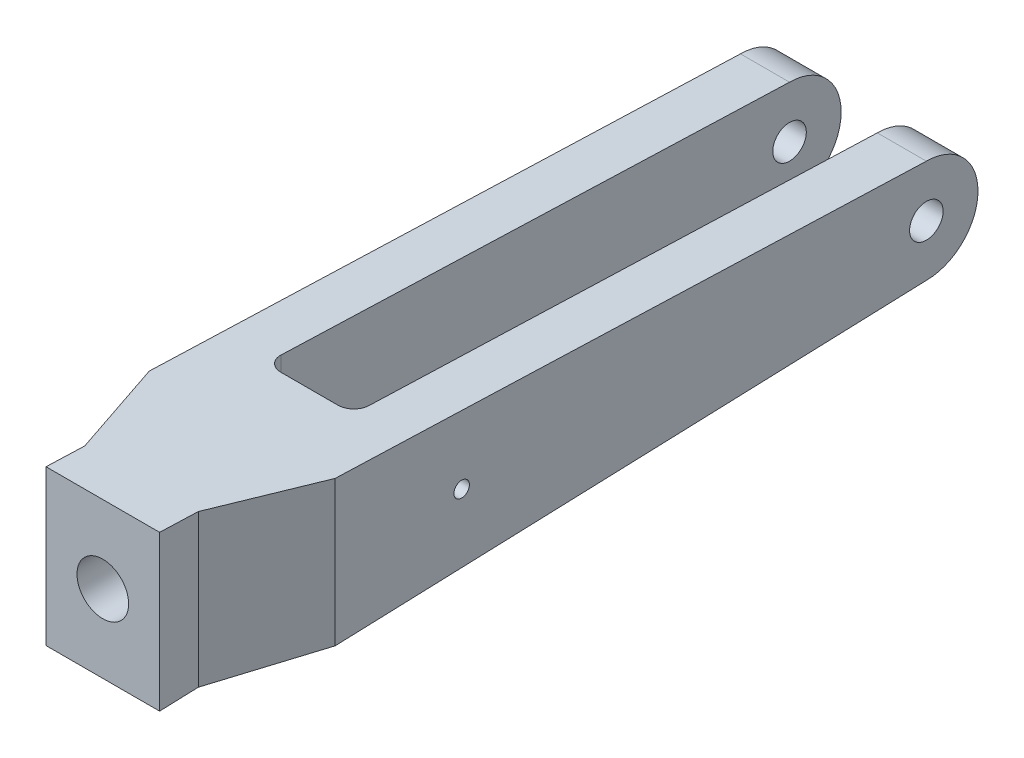
ISO-10303-21;
HEADER;
FILE_DESCRIPTION(('STEP AP214'),'2;1');
FILE_NAME('part.step','',(''),(''),'','','');
FILE_SCHEMA(('AUTOMOTIVE_DESIGN { 1 0 10303 214 1 1 1 1 }'));
ENDSEC;
DATA;
#1=APPLICATION_CONTEXT('core data for automotive mechanical design processes');
#2=APPLICATION_PROTOCOL_DEFINITION('international standard','automotive_design',2000,#1);
#3=PRODUCT_CONTEXT('',#1,'mechanical');
#4=PRODUCT('Part','Part','',(#3));
#5=PRODUCT_RELATED_PRODUCT_CATEGORY('part','',(#4));
#6=PRODUCT_DEFINITION_FORMATION('','',#4);
#7=PRODUCT_DEFINITION_CONTEXT('part definition',#1,'design');
#8=PRODUCT_DEFINITION('design','',#6,#7);
#9=PRODUCT_DEFINITION_SHAPE('','',#8);
#10=(LENGTH_UNIT() NAMED_UNIT(*) SI_UNIT(.MILLI.,.METRE.));
#11=(NAMED_UNIT(*) PLANE_ANGLE_UNIT() SI_UNIT($,.RADIAN.));
#12=(NAMED_UNIT(*) SI_UNIT($,.STERADIAN.) SOLID_ANGLE_UNIT());
#13=UNCERTAINTY_MEASURE_WITH_UNIT(LENGTH_MEASURE(1.E-05),#10,'distance_accuracy_value','');
#14=(GEOMETRIC_REPRESENTATION_CONTEXT(3) GLOBAL_UNCERTAINTY_ASSIGNED_CONTEXT((#13)) GLOBAL_UNIT_ASSIGNED_CONTEXT((#10,
#11,#12)) REPRESENTATION_CONTEXT('',''));
#15=CARTESIAN_POINT('',(0.,0.,0.));
#16=DIRECTION('',(0.,0.,1.));
#17=DIRECTION('',(1.,0.,0.));
#18=AXIS2_PLACEMENT_3D('',#15,#16,#17);
#19=CARTESIAN_POINT('',(28.9987484387064,30.,-26.9990106338886));
#20=DIRECTION('',(-1.,0.,0.));
#21=DIRECTION('',(0.,0.,1.));
#22=AXIS2_PLACEMENT_3D('',#19,#20,#21);
#23=PLANE('',#22);
#24=CARTESIAN_POINT('',(28.9987484387064,15.,-141.499010633889));
#25=DIRECTION('',(1.,0.,0.));
#26=DIRECTION('',(0.,0.,-1.));
#27=AXIS2_PLACEMENT_3D('',#24,#25,#26);
#28=CIRCLE('',#27,3.25000000000001);
#29=CARTESIAN_POINT('',(28.9987484387064,15.,-144.749010633889));
#30=VERTEX_POINT('',#29);
#31=EDGE_CURVE('E244',#30,#30,#28,.T.);
#32=ORIENTED_EDGE('',*,*,#31,.F.);
#33=EDGE_LOOP('',(#32));
#34=FACE_BOUND('',#33,.T.);
#35=CARTESIAN_POINT('',(28.9987484387064,15.,-51.4990106338886));
#36=DIRECTION('',(1.,0.,0.));
#37=DIRECTION('',(0.,0.,-1.));
#38=AXIS2_PLACEMENT_3D('',#35,#36,#37);
#39=CIRCLE('',#38,1.5);
#40=CARTESIAN_POINT('',(28.9987484387064,15.,-52.9990106338886));
#41=VERTEX_POINT('',#40);
#42=EDGE_CURVE('E241',#41,#41,#39,.T.);
#43=ORIENTED_EDGE('',*,*,#42,.F.);
#44=EDGE_LOOP('',(#43));
#45=FACE_BOUND('',#44,.T.);
#46=DIRECTION('',(0.,0.0353136494193685,-0.999376278568131));
#47=VECTOR('',#46,1.);
#48=CARTESIAN_POINT('',(28.9987484387064,3.49163363455736E-05,1.23379280373051E-06));
#49=LINE('',#48,#47);
#50=CARTESIAN_POINT('',(28.9987484387064,0.954063604240281,-26.9990106338886));
#51=VERTEX_POINT('',#50);
#52=CARTESIAN_POINT('',(28.9987484387064,4.99999999999999,-141.499010633889));
#53=VERTEX_POINT('',#52);
#54=EDGE_CURVE('E232',#51,#53,#49,.T.);
#55=ORIENTED_EDGE('',*,*,#54,.T.);
#56=CARTESIAN_POINT('',(28.9987484387064,15.,-141.499010633889));
#57=DIRECTION('',(1.,0.,0.));
#58=DIRECTION('',(0.,0.,-1.));
#59=AXIS2_PLACEMENT_3D('',#56,#57,#58);
#60=CIRCLE('',#59,10.);
#61=CARTESIAN_POINT('',(28.9987484387064,25.,-141.499010633889));
#62=VERTEX_POINT('',#61);
#63=EDGE_CURVE('E217',#53,#62,#60,.T.);
#64=ORIENTED_EDGE('',*,*,#63,.T.);
#65=DIRECTION('',(0.,-0.0353136494193685,-0.999376278568131));
#66=VECTOR('',#65,1.);
#67=CARTESIAN_POINT('',(28.9987484387064,29.9625534686042,-1.05874747238884));
#68=LINE('',#67,#66);
#69=CARTESIAN_POINT('',(28.9987484387064,29.0459363957597,-26.9990106338886));
#70=VERTEX_POINT('',#69);
#71=EDGE_CURVE('E228',#70,#62,#68,.T.);
#72=ORIENTED_EDGE('',*,*,#71,.F.);
#73=DIRECTION('',(0.,-1.,0.));
#74=VECTOR('',#73,1.);
#75=CARTESIAN_POINT('',(28.9987484387064,30.,-26.9990106338886));
#76=LINE('',#75,#74);
#77=EDGE_CURVE('E240',#70,#51,#76,.T.);
#78=ORIENTED_EDGE('',*,*,#77,.T.);
#79=EDGE_LOOP('',(#55,#64,#72,#78));
#80=FACE_BOUND('',#79,.T.);
#81=ADVANCED_FACE('F118',(#34,#45,#80),#23,.F.);
#82=CARTESIAN_POINT('',(19.4987484387064,30.,-39.9990106338886));
#83=DIRECTION('',(1.,0.,0.));
#84=DIRECTION('',(0.,0.,-1.));
#85=AXIS2_PLACEMENT_3D('',#82,#83,#84);
#86=PLANE('',#85);
#87=CARTESIAN_POINT('',(19.4987484387064,15.,-141.499010633889));
#88=DIRECTION('',(1.,0.,0.));
#89=DIRECTION('',(0.,0.,-1.));
#90=AXIS2_PLACEMENT_3D('',#87,#88,#89);
#91=CIRCLE('',#90,3.25000000000001);
#92=CARTESIAN_POINT('',(19.4987484387064,15.,-144.749010633889));
#93=VERTEX_POINT('',#92);
#94=EDGE_CURVE('E229',#93,#93,#91,.T.);
#95=ORIENTED_EDGE('',*,*,#94,.T.);
#96=EDGE_LOOP('',(#95));
#97=FACE_BOUND('',#96,.T.);
#98=CARTESIAN_POINT('',(19.4987484387064,15.,-51.4990106338886));
#99=DIRECTION('',(1.,0.,0.));
#100=DIRECTION('',(0.,0.,-1.));
#101=AXIS2_PLACEMENT_3D('',#98,#99,#100);
#102=CIRCLE('',#101,1.5);
#103=CARTESIAN_POINT('',(19.4987484387064,15.,-52.9990106338886));
#104=VERTEX_POINT('',#103);
#105=EDGE_CURVE('E269',#104,#104,#102,.T.);
#106=ORIENTED_EDGE('',*,*,#105,.T.);
#107=EDGE_LOOP('',(#106));
#108=FACE_BOUND('',#107,.T.);
#109=DIRECTION('',(0.,0.0353136494193685,-0.999376278568131));
#110=VECTOR('',#109,1.);
#111=CARTESIAN_POINT('',(19.4987484387064,1.44907655663495,-41.0078771866577));
#112=LINE('',#111,#110);
#113=CARTESIAN_POINT('',(19.4987484387064,1.51943462897526,-42.9990106338886));
#114=VERTEX_POINT('',#113);
#115=CARTESIAN_POINT('',(19.4987484387064,4.99999999999999,-141.499010633889));
#116=VERTEX_POINT('',#115);
#117=EDGE_CURVE('E234',#114,#116,#112,.T.);
#118=ORIENTED_EDGE('',*,*,#117,.F.);
#119=DIRECTION('',(0.,-1.,0.));
#120=VECTOR('',#119,1.);
#121=CARTESIAN_POINT('',(19.4987484387064,28.5865724381625,-42.9990106338886));
#122=LINE('',#121,#120);
#123=CARTESIAN_POINT('',(19.4987484387064,28.4805653710247,-42.9990106338886));
#124=VERTEX_POINT('',#123);
#125=EDGE_CURVE('E133',#114,#124,#122,.F.);
#126=ORIENTED_EDGE('',*,*,#125,.T.);
#127=DIRECTION('',(0.,-0.0353136494193685,-0.999376278568131));
#128=VECTOR('',#127,1.);
#129=CARTESIAN_POINT('',(19.4987484387064,28.5883350584245,-39.9491284804761));
#130=LINE('',#129,#128);
#131=CARTESIAN_POINT('',(19.4987484387064,25.,-141.499010633889));
#132=VERTEX_POINT('',#131);
#133=EDGE_CURVE('E302',#124,#132,#130,.T.);
#134=ORIENTED_EDGE('',*,*,#133,.T.);
#135=CARTESIAN_POINT('',(19.4987484387064,15.,-141.499010633889));
#136=DIRECTION('',(1.,0.,0.));
#137=DIRECTION('',(0.,0.,-1.));
#138=AXIS2_PLACEMENT_3D('',#135,#136,#137);
#139=CIRCLE('',#138,10.);
#140=EDGE_CURVE('E306',#116,#132,#139,.T.);
#141=ORIENTED_EDGE('',*,*,#140,.F.);
#142=EDGE_LOOP('',(#118,#126,#134,#141));
#143=FACE_BOUND('',#142,.T.);
#144=ADVANCED_FACE('F368',(#97,#108,#143),#86,.F.);
#145=CARTESIAN_POINT('',(2.4987484387064,30.,-151.499010633889));
#146=DIRECTION('',(-1.,0.,0.));
#147=DIRECTION('',(0.,0.,1.));
#148=AXIS2_PLACEMENT_3D('',#145,#146,#147);
#149=PLANE('',#148);
#150=CARTESIAN_POINT('',(2.4987484387064,15.,-141.499010633889));
#151=DIRECTION('',(-1.,0.,0.));
#152=DIRECTION('',(0.,0.,1.));
#153=AXIS2_PLACEMENT_3D('',#150,#151,#152);
#154=CIRCLE('',#153,3.25000000000001);
#155=CARTESIAN_POINT('',(2.4987484387064,15.,-144.749010633889));
#156=VERTEX_POINT('',#155);
#157=EDGE_CURVE('E273',#156,#156,#154,.T.);
#158=ORIENTED_EDGE('',*,*,#157,.T.);
#159=EDGE_LOOP('',(#158));
#160=FACE_BOUND('',#159,.T.);
#161=CARTESIAN_POINT('',(2.49874843870641,15.,-51.4990106338886));
#162=DIRECTION('',(-1.,0.,0.));
#163=DIRECTION('',(0.,0.,1.));
#164=AXIS2_PLACEMENT_3D('',#161,#162,#163);
#165=CIRCLE('',#164,1.5);
#166=CARTESIAN_POINT('',(2.4987484387064,15.,-52.9990106338886));
#167=VERTEX_POINT('',#166);
#168=EDGE_CURVE('E266',#167,#167,#165,.T.);
#169=ORIENTED_EDGE('',*,*,#168,.T.);
#170=EDGE_LOOP('',(#169));
#171=FACE_BOUND('',#170,.T.);
#172=DIRECTION('',(0.,0.0353136494193685,0.999376278568131));
#173=VECTOR('',#172,1.);
#174=CARTESIAN_POINT('',(2.4987484387064,24.6533190337827,-151.310081977839));
#175=LINE('',#174,#173);
#176=CARTESIAN_POINT('',(2.4987484387064,25.,-141.499010633889));
#177=VERTEX_POINT('',#176);
#178=CARTESIAN_POINT('',(2.49874843870641,28.4805653710247,-42.9990106338886));
#179=VERTEX_POINT('',#178);
#180=EDGE_CURVE('E296',#177,#179,#175,.T.);
#181=ORIENTED_EDGE('',*,*,#180,.T.);
#182=DIRECTION('',(0.,-1.,0.));
#183=VECTOR('',#182,1.);
#184=CARTESIAN_POINT('',(2.49874843870641,1.41342756183745,-42.9990106338886));
#185=LINE('',#184,#183);
#186=CARTESIAN_POINT('',(2.49874843870641,1.51943462897526,-42.9990106338886));
#187=VERTEX_POINT('',#186);
#188=EDGE_CURVE('E331',#179,#187,#185,.T.);
#189=ORIENTED_EDGE('',*,*,#188,.T.);
#190=DIRECTION('',(0.,-0.0353136494193685,0.999376278568131));
#191=VECTOR('',#190,1.);
#192=CARTESIAN_POINT('',(2.4987484387064,5.38409258127672,-152.36883068402));
#193=LINE('',#192,#191);
#194=CARTESIAN_POINT('',(2.4987484387064,4.99999999999999,-141.499010633889));
#195=VERTEX_POINT('',#194);
#196=EDGE_CURVE('E261',#195,#187,#193,.T.);
#197=ORIENTED_EDGE('',*,*,#196,.F.);
#198=CARTESIAN_POINT('',(2.4987484387064,15.,-141.499010633889));
#199=DIRECTION('',(-1.,0.,0.));
#200=DIRECTION('',(0.,0.,1.));
#201=AXIS2_PLACEMENT_3D('',#198,#199,#200);
#202=CIRCLE('',#201,10.);
#203=EDGE_CURVE('E304',#177,#195,#202,.T.);
#204=ORIENTED_EDGE('',*,*,#203,.F.);
#205=EDGE_LOOP('',(#181,#189,#197,#204));
#206=FACE_BOUND('',#205,.T.);
#207=ADVANCED_FACE('F358',(#160,#171,#206),#149,.F.);
#208=CARTESIAN_POINT('',(-7.0012515612936,30.,-26.9990106338886));
#209=DIRECTION('',(1.,0.,0.));
#210=DIRECTION('',(0.,0.,-1.));
#211=AXIS2_PLACEMENT_3D('',#208,#209,#210);
#212=PLANE('',#211);
#213=CARTESIAN_POINT('',(-7.00125156129361,15.,-141.499010633889));
#214=DIRECTION('',(1.,0.,0.));
#215=DIRECTION('',(0.,0.,-1.));
#216=AXIS2_PLACEMENT_3D('',#213,#214,#215);
#217=CIRCLE('',#216,3.25000000000001);
#218=CARTESIAN_POINT('',(-7.00125156129361,15.,-144.749010633889));
#219=VERTEX_POINT('',#218);
#220=EDGE_CURVE('E272',#219,#219,#217,.T.);
#221=ORIENTED_EDGE('',*,*,#220,.T.);
#222=EDGE_LOOP('',(#221));
#223=FACE_BOUND('',#222,.T.);
#224=CARTESIAN_POINT('',(-7.00125156129361,15.,-51.4990106338886));
#225=DIRECTION('',(1.,0.,0.));
#226=DIRECTION('',(0.,0.,-1.));
#227=AXIS2_PLACEMENT_3D('',#224,#225,#226);
#228=CIRCLE('',#227,1.5);
#229=CARTESIAN_POINT('',(-7.00125156129361,15.,-52.9990106338886));
#230=VERTEX_POINT('',#229);
#231=EDGE_CURVE('E265',#230,#230,#228,.T.);
#232=ORIENTED_EDGE('',*,*,#231,.T.);
#233=EDGE_LOOP('',(#232));
#234=FACE_BOUND('',#233,.T.);
#235=CARTESIAN_POINT('',(-7.00125156129361,15.,-141.499010633889));
#236=DIRECTION('',(1.,0.,0.));
#237=DIRECTION('',(0.,0.,-1.));
#238=AXIS2_PLACEMENT_3D('',#235,#236,#237);
#239=CIRCLE('',#238,10.);
#240=CARTESIAN_POINT('',(-7.00125156129361,4.99999999999999,-141.499010633889));
#241=VERTEX_POINT('',#240);
#242=CARTESIAN_POINT('',(-7.00125156129361,25.,-141.499010633889));
#243=VERTEX_POINT('',#242);
#244=EDGE_CURVE('E329',#241,#243,#239,.T.);
#245=ORIENTED_EDGE('',*,*,#244,.F.);
#246=DIRECTION('',(0.,0.0353136494193685,-0.999376278568131));
#247=VECTOR('',#246,1.);
#248=CARTESIAN_POINT('',(-7.0012515612936,0.990285450622901,-28.0240888865168));
#249=LINE('',#248,#247);
#250=CARTESIAN_POINT('',(-7.0012515612936,0.954063604240281,-26.9990106338886));
#251=VERTEX_POINT('',#250);
#252=EDGE_CURVE('E256',#251,#241,#249,.T.);
#253=ORIENTED_EDGE('',*,*,#252,.F.);
#254=DIRECTION('',(0.,-1.,0.));
#255=VECTOR('',#254,1.);
#256=CARTESIAN_POINT('',(-7.0012515612936,30.,-26.9990106338886));
#257=LINE('',#256,#255);
#258=CARTESIAN_POINT('',(-7.0012515612936,29.0459363957597,-26.9990106338886));
#259=VERTEX_POINT('',#258);
#260=EDGE_CURVE('E326',#259,#251,#257,.T.);
#261=ORIENTED_EDGE('',*,*,#260,.F.);
#262=DIRECTION('',(0.,-0.0353136494193685,-0.999376278568131));
#263=VECTOR('',#262,1.);
#264=CARTESIAN_POINT('',(-7.0012515612936,29.0471261644365,-26.9653401803351));
#265=LINE('',#264,#263);
#266=EDGE_CURVE('E293',#259,#243,#265,.T.);
#267=ORIENTED_EDGE('',*,*,#266,.T.);
#268=EDGE_LOOP('',(#245,#253,#261,#267));
#269=FACE_BOUND('',#268,.T.);
#270=ADVANCED_FACE('F376',(#223,#234,#269),#212,.F.);
#271=CARTESIAN_POINT('',(2.49874843870641,30.,-39.9990106338886));
#272=DIRECTION('',(0.,0.,1.));
#273=DIRECTION('',(1.,0.,0.));
#274=AXIS2_PLACEMENT_3D('',#271,#272,#273);
#275=PLANE('',#274);
#276=DIRECTION('',(1.,0.,0.));
#277=VECTOR('',#276,1.);
#278=CARTESIAN_POINT('',(2.49874843870641,1.41342756183745,-39.9990106338886));
#279=LINE('',#278,#277);
#280=CARTESIAN_POINT('',(5.49874843870641,1.41342756183745,-39.9990106338886));
#281=VERTEX_POINT('',#280);
#282=CARTESIAN_POINT('',(16.4987484387064,1.41342756183745,-39.9990106338886));
#283=VERTEX_POINT('',#282);
#284=EDGE_CURVE('E259',#281,#283,#279,.T.);
#285=ORIENTED_EDGE('',*,*,#284,.F.);
#286=DIRECTION('',(0.,-1.,0.));
#287=VECTOR('',#286,1.);
#288=CARTESIAN_POINT('',(5.49874843870641,28.5865724381625,-39.9990106338886));
#289=LINE('',#288,#287);
#290=CARTESIAN_POINT('',(5.49874843870641,28.5865724381625,-39.9990106338886));
#291=VERTEX_POINT('',#290);
#292=EDGE_CURVE('E341',#281,#291,#289,.F.);
#293=ORIENTED_EDGE('',*,*,#292,.T.);
#294=DIRECTION('',(1.,0.,0.));
#295=VECTOR('',#294,1.);
#296=CARTESIAN_POINT('',(2.49874843870641,28.5865724381625,-39.9990106338886));
#297=LINE('',#296,#295);
#298=CARTESIAN_POINT('',(16.4987484387064,28.5865724381625,-39.9990106338886));
#299=VERTEX_POINT('',#298);
#300=EDGE_CURVE('E299',#291,#299,#297,.T.);
#301=ORIENTED_EDGE('',*,*,#300,.T.);
#302=DIRECTION('',(0.,-1.,0.));
#303=VECTOR('',#302,1.);
#304=CARTESIAN_POINT('',(16.4987484387064,1.41342756183745,-39.9990106338886));
#305=LINE('',#304,#303);
#306=EDGE_CURVE('E338',#299,#283,#305,.T.);
#307=ORIENTED_EDGE('',*,*,#306,.T.);
#308=EDGE_LOOP('',(#285,#293,#301,#307));
#309=FACE_BOUND('',#308,.T.);
#310=ADVANCED_FACE('F364',(#309),#275,.F.);
#311=CARTESIAN_POINT('',(-0.00125156129360176,30.,-7.49901063388862));
#312=DIRECTION('',(0.941194670761707,0.,-0.337864753606767));
#313=DIRECTION('',(-0.337864753606767,0.,-0.941194670761707));
#314=AXIS2_PLACEMENT_3D('',#311,#312,#313);
#315=PLANE('',#314);
#316=DIRECTION('',(-0.33767805595744,0.0332393846096419,-0.940674584452868));
#317=VECTOR('',#316,1.);
#318=CARTESIAN_POINT('',(-0.335003270416462,0.297870561978272,-8.42874753787373));
#319=LINE('',#318,#317);
#320=CARTESIAN_POINT('',(-0.00125156129360176,0.265017667844525,-7.49901063388862));
#321=VERTEX_POINT('',#320);
#322=EDGE_CURVE('E254',#321,#251,#319,.T.);
#323=ORIENTED_EDGE('',*,*,#322,.F.);
#324=DIRECTION('',(0.,-1.,0.));
#325=VECTOR('',#324,1.);
#326=CARTESIAN_POINT('',(-0.00125156129360176,30.,-7.49901063388862));
#327=LINE('',#326,#325);
#328=CARTESIAN_POINT('',(-0.00125156129360176,29.7349823321555,-7.49901063388862));
#329=VERTEX_POINT('',#328);
#330=EDGE_CURVE('E323',#329,#321,#327,.T.);
#331=ORIENTED_EDGE('',*,*,#330,.F.);
#332=DIRECTION('',(-0.33767805595744,-0.0332393846096419,-0.940674584452868));
#333=VECTOR('',#332,1.);
#334=CARTESIAN_POINT('',(0.00172305286970355,29.7352751386986,-7.49072420871941));
#335=LINE('',#334,#333);
#336=EDGE_CURVE('E290',#329,#259,#335,.T.);
#337=ORIENTED_EDGE('',*,*,#336,.T.);
#338=ORIENTED_EDGE('',*,*,#260,.T.);
#339=EDGE_LOOP('',(#323,#331,#337,#338));
#340=FACE_BOUND('',#339,.T.);
#341=ADVANCED_FACE('F429',(#340),#315,.F.);
#342=CARTESIAN_POINT('',(-0.00125156129360176,30.,0.000989366111383465));
#343=DIRECTION('',(1.,0.,0.));
#344=DIRECTION('',(0.,0.,-1.));
#345=AXIS2_PLACEMENT_3D('',#342,#343,#344);
#346=PLANE('',#345);
#347=DIRECTION('',(0.,0.0353136494193685,-0.999376278568131));
#348=VECTOR('',#347,1.);
#349=CARTESIAN_POINT('',(-0.00125156129360176,0.0374116150594246,-1.05775934007026));
#350=LINE('',#349,#348);
#351=CARTESIAN_POINT('',(-0.0012515612936026,0.,0.000989366111383465));
#352=VERTEX_POINT('',#351);
#353=EDGE_CURVE('E252',#352,#321,#350,.T.);
#354=ORIENTED_EDGE('',*,*,#353,.F.);
#355=DIRECTION('',(0.,-1.,0.));
#356=VECTOR('',#355,1.);
#357=CARTESIAN_POINT('',(-0.00125156129360176,30.,0.000989366111383465));
#358=LINE('',#357,#356);
#359=CARTESIAN_POINT('',(-0.00125156129360176,30.,0.000989366111383465));
#360=VERTEX_POINT('',#359);
#361=EDGE_CURVE('E320',#360,#352,#358,.T.);
#362=ORIENTED_EDGE('',*,*,#361,.F.);
#363=DIRECTION('',(0.,-0.0353136494193685,-0.999376278568131));
#364=VECTOR('',#363,1.);
#365=CARTESIAN_POINT('',(-0.00125156129360176,30.,0.000989366111383465));
#366=LINE('',#365,#364);
#367=EDGE_CURVE('E287',#360,#329,#366,.T.);
#368=ORIENTED_EDGE('',*,*,#367,.T.);
#369=ORIENTED_EDGE('',*,*,#330,.T.);
#370=EDGE_LOOP('',(#354,#362,#368,#369));
#371=FACE_BOUND('',#370,.T.);
#372=ADVANCED_FACE('F432',(#371),#346,.F.);
#373=CARTESIAN_POINT('',(21.9987484387064,30.,0.000989366111383465));
#374=DIRECTION('',(-1.,0.,0.));
#375=DIRECTION('',(0.,0.,1.));
#376=AXIS2_PLACEMENT_3D('',#373,#374,#375);
#377=PLANE('',#376);
#378=DIRECTION('',(0.,-0.0353136494193685,0.999376278568131));
#379=VECTOR('',#378,1.);
#380=CARTESIAN_POINT('',(21.9987484387064,0.0374116150594246,-1.05775934007026));
#381=LINE('',#380,#379);
#382=CARTESIAN_POINT('',(21.9987484387064,0.265017667844522,-7.49901063388862));
#383=VERTEX_POINT('',#382);
#384=CARTESIAN_POINT('',(21.9987484387064,0.,0.000989366111383465));
#385=VERTEX_POINT('',#384);
#386=EDGE_CURVE('E250',#383,#385,#381,.T.);
#387=ORIENTED_EDGE('',*,*,#386,.F.);
#388=DIRECTION('',(0.,-1.,0.));
#389=VECTOR('',#388,1.);
#390=CARTESIAN_POINT('',(21.9987484387064,30.,-7.49901063388862));
#391=LINE('',#390,#389);
#392=CARTESIAN_POINT('',(21.9987484387064,29.7349823321555,-7.49901063388862));
#393=VERTEX_POINT('',#392);
#394=EDGE_CURVE('E314',#393,#383,#391,.T.);
#395=ORIENTED_EDGE('',*,*,#394,.F.);
#396=DIRECTION('',(0.,0.0353136494193685,0.999376278568131));
#397=VECTOR('',#396,1.);
#398=CARTESIAN_POINT('',(21.9987484387064,30.,0.000989366111383465));
#399=LINE('',#398,#397);
#400=CARTESIAN_POINT('',(21.9987484387064,30.,0.000989366111383248));
#401=VERTEX_POINT('',#400);
#402=EDGE_CURVE('E284',#393,#401,#399,.T.);
#403=ORIENTED_EDGE('',*,*,#402,.T.);
#404=DIRECTION('',(0.,-1.,0.));
#405=VECTOR('',#404,1.);
#406=CARTESIAN_POINT('',(21.9987484387064,30.,0.000989366111383465));
#407=LINE('',#406,#405);
#408=EDGE_CURVE('E317',#401,#385,#407,.T.);
#409=ORIENTED_EDGE('',*,*,#408,.T.);
#410=EDGE_LOOP('',(#387,#395,#403,#409));
#411=FACE_BOUND('',#410,.T.);
#412=ADVANCED_FACE('F440',(#411),#377,.F.);
#413=CARTESIAN_POINT('',(21.9987484387064,30.,-7.49901063388862));
#414=DIRECTION('',(-0.941194670761707,0.,-0.337864753606767));
#415=DIRECTION('',(-0.337864753606767,0.,0.941194670761707));
#416=AXIS2_PLACEMENT_3D('',#413,#414,#415);
#417=PLANE('',#416);
#418=DIRECTION('',(-0.33767805595744,-0.0332393846096419,0.940674584452868));
#419=VECTOR('',#418,1.);
#420=CARTESIAN_POINT('',(22.3325001478293,0.297870561978272,-8.42874753787373));
#421=LINE('',#420,#419);
#422=EDGE_CURVE('E248',#51,#383,#421,.T.);
#423=ORIENTED_EDGE('',*,*,#422,.F.);
#424=ORIENTED_EDGE('',*,*,#77,.F.);
#425=DIRECTION('',(-0.33767805595744,0.0332393846096419,0.940674584452868));
#426=VECTOR('',#425,1.);
#427=CARTESIAN_POINT('',(21.9957738245431,29.7352751386986,-7.49072420871941));
#428=LINE('',#427,#426);
#429=EDGE_CURVE('E281',#70,#393,#428,.T.);
#430=ORIENTED_EDGE('',*,*,#429,.T.);
#431=ORIENTED_EDGE('',*,*,#394,.T.);
#432=EDGE_LOOP('',(#423,#424,#430,#431));
#433=FACE_BOUND('',#432,.T.);
#434=ADVANCED_FACE('F443',(#433),#417,.F.);
#435=CARTESIAN_POINT('',(-0.00125156129360176,30.,0.000989366111383465));
#436=DIRECTION('',(0.,0.,-1.));
#437=DIRECTION('',(-1.,0.,0.));
#438=AXIS2_PLACEMENT_3D('',#435,#436,#437);
#439=PLANE('',#438);
#440=CARTESIAN_POINT('',(10.9987484387064,15.,0.000989366111383465));
#441=DIRECTION('',(0.,0.,1.));
#442=DIRECTION('',(1.,0.,0.));
#443=AXIS2_PLACEMENT_3D('',#440,#441,#442);
#444=CIRCLE('',#443,5.);
#445=CARTESIAN_POINT('',(15.9987484387064,15.,0.000989366111383465));
#446=VERTEX_POINT('',#445);
#447=EDGE_CURVE('E578',#446,#446,#444,.T.);
#448=ORIENTED_EDGE('',*,*,#447,.F.);
#449=EDGE_LOOP('',(#448));
#450=FACE_BOUND('',#449,.T.);
#451=DIRECTION('',(1.,0.,0.));
#452=VECTOR('',#451,1.);
#453=CARTESIAN_POINT('',(-0.00125156129360176,0.,0.000989366111383465));
#454=LINE('',#453,#452);
#455=EDGE_CURVE('E308',#352,#385,#454,.T.);
#456=ORIENTED_EDGE('',*,*,#455,.T.);
#457=ORIENTED_EDGE('',*,*,#408,.F.);
#458=DIRECTION('',(1.,0.,0.));
#459=VECTOR('',#458,1.);
#460=CARTESIAN_POINT('',(-0.00125156129360176,30.,0.000989366111383465));
#461=LINE('',#460,#459);
#462=EDGE_CURVE('E309',#360,#401,#461,.T.);
#463=ORIENTED_EDGE('',*,*,#462,.F.);
#464=ORIENTED_EDGE('',*,*,#361,.T.);
#465=EDGE_LOOP('',(#456,#457,#463,#464));
#466=FACE_BOUND('',#465,.T.);
#467=ADVANCED_FACE('F441',(#450,#466),#439,.F.);
#468=CARTESIAN_POINT('',(-71.0012515612936,15.,-141.499010633889));
#469=DIRECTION('',(1.,0.,0.));
#470=DIRECTION('',(0.,0.,-1.));
#471=AXIS2_PLACEMENT_3D('',#468,#469,#470);
#472=CYLINDRICAL_SURFACE('',#471,10.);
#473=ORIENTED_EDGE('',*,*,#140,.T.);
#474=DIRECTION('',(1.,0.,0.));
#475=VECTOR('',#474,1.);
#476=CARTESIAN_POINT('',(-71.0012515612936,25.,-141.499010633889));
#477=LINE('',#476,#475);
#478=EDGE_CURVE('E223',#132,#62,#477,.T.);
#479=ORIENTED_EDGE('',*,*,#478,.T.);
#480=ORIENTED_EDGE('',*,*,#63,.F.);
#481=DIRECTION('',(1.,0.,0.));
#482=VECTOR('',#481,1.);
#483=CARTESIAN_POINT('',(-71.0012515612936,4.99999999999999,-141.499010633889));
#484=LINE('',#483,#482);
#485=EDGE_CURVE('E221',#116,#53,#484,.T.);
#486=ORIENTED_EDGE('',*,*,#485,.F.);
#487=EDGE_LOOP('',(#473,#479,#480,#486));
#488=FACE_BOUND('',#487,.T.);
#489=ADVANCED_FACE('F220',(#488),#472,.T.);
#490=ORIENTED_EDGE('',*,*,#203,.T.);
#491=EDGE_CURVE('E236',#241,#195,#484,.T.);
#492=ORIENTED_EDGE('',*,*,#491,.F.);
#493=ORIENTED_EDGE('',*,*,#244,.T.);
#494=EDGE_CURVE('E280',#243,#177,#477,.T.);
#495=ORIENTED_EDGE('',*,*,#494,.T.);
#496=EDGE_LOOP('',(#490,#492,#493,#495));
#497=FACE_BOUND('',#496,.T.);
#498=ADVANCED_FACE('F426',(#497),#472,.T.);
#499=CARTESIAN_POINT('',(-71.0012515612936,29.9625534686042,-1.05874747238884));
#500=DIRECTION('',(0.,-0.999376278568131,0.0353136494193685));
#501=DIRECTION('',(0.,-0.0353136494193685,-0.999376278568131));
#502=AXIS2_PLACEMENT_3D('',#499,#500,#501);
#503=PLANE('',#502);
#504=ORIENTED_EDGE('',*,*,#300,.F.);
#505=CARTESIAN_POINT('',(5.49874843870641,28.4805653710247,-42.9990106338886));
#506=DIRECTION('',(0.,-0.999376278568131,0.0353136494193685));
#507=DIRECTION('',(0.,0.0353136494193685,0.999376278568131));
#508=AXIS2_PLACEMENT_3D('',#505,#506,#507);
#509=ELLIPSE('',#508,3.00187233210927,3.);
#510=EDGE_CURVE('E346',#291,#179,#509,.T.);
#511=ORIENTED_EDGE('',*,*,#510,.T.);
#512=ORIENTED_EDGE('',*,*,#180,.F.);
#513=ORIENTED_EDGE('',*,*,#494,.F.);
#514=ORIENTED_EDGE('',*,*,#266,.F.);
#515=ORIENTED_EDGE('',*,*,#336,.F.);
#516=ORIENTED_EDGE('',*,*,#367,.F.);
#517=ORIENTED_EDGE('',*,*,#462,.T.);
#518=ORIENTED_EDGE('',*,*,#402,.F.);
#519=ORIENTED_EDGE('',*,*,#429,.F.);
#520=ORIENTED_EDGE('',*,*,#71,.T.);
#521=ORIENTED_EDGE('',*,*,#478,.F.);
#522=ORIENTED_EDGE('',*,*,#133,.F.);
#523=CARTESIAN_POINT('',(16.4987484387064,28.4805653710247,-42.9990106338886));
#524=DIRECTION('',(0.,-0.999376278568131,0.0353136494193685));
#525=DIRECTION('',(0.,0.0353136494193685,0.999376278568131));
#526=AXIS2_PLACEMENT_3D('',#523,#524,#525);
#527=ELLIPSE('',#526,3.00187233210927,3.);
#528=EDGE_CURVE('E12',#124,#299,#527,.T.);
#529=ORIENTED_EDGE('',*,*,#528,.T.);
#530=EDGE_LOOP('',(#504,#511,#512,#513,#514,#515,#516,#517,#518,#519,#520,#521,#522,#529));
#531=FACE_BOUND('',#530,.T.);
#532=ADVANCED_FACE('F350',(#531),#503,.F.);
#533=CARTESIAN_POINT('',(-71.0012515612936,3.49163363455736E-05,1.23379280373051E-06));
#534=DIRECTION('',(0.,-0.999376278568131,-0.0353136494193685));
#535=DIRECTION('',(0.,0.0353136494193685,-0.999376278568131));
#536=AXIS2_PLACEMENT_3D('',#533,#534,#535);
#537=PLANE('',#536);
#538=ORIENTED_EDGE('',*,*,#284,.T.);
#539=CARTESIAN_POINT('',(16.4987484387064,1.51943462897526,-42.9990106338886));
#540=DIRECTION('',(0.,-0.999376278568131,-0.0353136494193685));
#541=DIRECTION('',(0.,0.0353136494193685,-0.999376278568131));
#542=AXIS2_PLACEMENT_3D('',#539,#540,#541);
#543=ELLIPSE('',#542,3.00187233210927,3.);
#544=EDGE_CURVE('E126',#283,#114,#543,.F.);
#545=ORIENTED_EDGE('',*,*,#544,.T.);
#546=ORIENTED_EDGE('',*,*,#117,.T.);
#547=ORIENTED_EDGE('',*,*,#485,.T.);
#548=ORIENTED_EDGE('',*,*,#54,.F.);
#549=ORIENTED_EDGE('',*,*,#422,.T.);
#550=ORIENTED_EDGE('',*,*,#386,.T.);
#551=ORIENTED_EDGE('',*,*,#455,.F.);
#552=ORIENTED_EDGE('',*,*,#353,.T.);
#553=ORIENTED_EDGE('',*,*,#322,.T.);
#554=ORIENTED_EDGE('',*,*,#252,.T.);
#555=ORIENTED_EDGE('',*,*,#491,.T.);
#556=ORIENTED_EDGE('',*,*,#196,.T.);
#557=CARTESIAN_POINT('',(5.49874843870641,1.51943462897526,-42.9990106338886));
#558=DIRECTION('',(0.,-0.999376278568131,-0.0353136494193685));
#559=DIRECTION('',(0.,0.0353136494193685,-0.999376278568131));
#560=AXIS2_PLACEMENT_3D('',#557,#558,#559);
#561=ELLIPSE('',#560,3.00187233210927,3.);
#562=EDGE_CURVE('E344',#187,#281,#561,.F.);
#563=ORIENTED_EDGE('',*,*,#562,.T.);
#564=EDGE_LOOP('',(#538,#545,#546,#547,#548,#549,#550,#551,#552,#553,#554,#555,#556,#563));
#565=FACE_BOUND('',#564,.T.);
#566=ADVANCED_FACE('F231',(#565),#537,.T.);
#567=CARTESIAN_POINT('',(-71.0012515612936,15.,-51.4990106338886));
#568=DIRECTION('',(1.,0.,0.));
#569=DIRECTION('',(0.,0.,-1.));
#570=AXIS2_PLACEMENT_3D('',#567,#568,#569);
#571=CYLINDRICAL_SURFACE('',#570,1.5);
#572=CARTESIAN_POINT('',(-7.00125156129361,15.,-52.9990106338886));
#573=CARTESIAN_POINT('',(-6.90229322796027,15.,-52.9990106338886));
#574=CARTESIAN_POINT('',(-6.80333489462694,15.,-52.9990106338886));
#575=CARTESIAN_POINT('',(-6.60541822796027,15.,-52.9990106338886));
#576=CARTESIAN_POINT('',(-6.50645989462694,15.,-52.9990106338886));
#577=CARTESIAN_POINT('',(-6.30854322796027,15.,-52.9990106338886));
#578=CARTESIAN_POINT('',(-6.20958489462694,15.,-52.9990106338886));
#579=CARTESIAN_POINT('',(-6.01166822796027,15.,-52.9990106338886));
#580=CARTESIAN_POINT('',(-5.91270989462693,15.,-52.9990106338886));
#581=CARTESIAN_POINT('',(-5.71479322796027,15.,-52.9990106338886));
#582=CARTESIAN_POINT('',(-5.61583489462694,15.,-52.9990106338886));
#583=CARTESIAN_POINT('',(-5.41791822796028,15.,-52.9990106338886));
#584=CARTESIAN_POINT('',(-5.31895989462694,15.,-52.9990106338886));
#585=CARTESIAN_POINT('',(-5.12104322796028,15.,-52.9990106338886));
#586=CARTESIAN_POINT('',(-5.02208489462694,15.,-52.9990106338886));
#587=CARTESIAN_POINT('',(-4.82416822796027,15.,-52.9990106338886));
#588=CARTESIAN_POINT('',(-4.72520989462694,15.,-52.9990106338886));
#589=CARTESIAN_POINT('',(-4.52729322796027,15.,-52.9990106338886));
#590=CARTESIAN_POINT('',(-4.42833489462694,15.,-52.9990106338886));
#591=CARTESIAN_POINT('',(-4.23041822796027,15.,-52.9990106338886));
#592=CARTESIAN_POINT('',(-4.13145989462694,15.,-52.9990106338886));
#593=CARTESIAN_POINT('',(-3.93354322796027,15.,-52.9990106338886));
#594=CARTESIAN_POINT('',(-3.83458489462693,15.,-52.9990106338886));
#595=CARTESIAN_POINT('',(-3.63666822796027,15.,-52.9990106338886));
#596=CARTESIAN_POINT('',(-3.53770989462694,15.,-52.9990106338886));
#597=CARTESIAN_POINT('',(-3.33979322796028,15.,-52.9990106338886));
#598=CARTESIAN_POINT('',(-3.24083489462694,15.,-52.9990106338886));
#599=CARTESIAN_POINT('',(-3.04291822796028,15.,-52.9990106338886));
#600=CARTESIAN_POINT('',(-2.94395989462694,15.,-52.9990106338886));
#601=CARTESIAN_POINT('',(-2.74604322796027,15.,-52.9990106338886));
#602=CARTESIAN_POINT('',(-2.64708489462694,15.,-52.9990106338886));
#603=CARTESIAN_POINT('',(-2.44916822796027,15.,-52.9990106338886));
#604=CARTESIAN_POINT('',(-2.35020989462694,15.,-52.9990106338886));
#605=CARTESIAN_POINT('',(-2.15229322796027,15.,-52.9990106338886));
#606=CARTESIAN_POINT('',(-2.05333489462694,15.,-52.9990106338886));
#607=CARTESIAN_POINT('',(-1.85541822796027,15.,-52.9990106338886));
#608=CARTESIAN_POINT('',(-1.75645989462693,15.,-52.9990106338886));
#609=CARTESIAN_POINT('',(-1.55854322796027,15.,-52.9990106338886));
#610=CARTESIAN_POINT('',(-1.45958489462693,15.,-52.9990106338886));
#611=CARTESIAN_POINT('',(-1.26166822796026,15.,-52.9990106338886));
#612=CARTESIAN_POINT('',(-1.16270989462693,15.,-52.9990106338886));
#613=CARTESIAN_POINT('',(-0.964793227960267,15.,-52.9990106338886));
#614=CARTESIAN_POINT('',(-0.865834894626938,15.,-52.9990106338886));
#615=CARTESIAN_POINT('',(-0.667918227960275,15.,-52.9990106338886));
#616=CARTESIAN_POINT('',(-0.568959894626941,15.,-52.9990106338886));
#617=CARTESIAN_POINT('',(-0.371043227960273,15.,-52.9990106338886));
#618=CARTESIAN_POINT('',(-0.272084894626939,15.,-52.9990106338886));
#619=CARTESIAN_POINT('',(-0.0741682279602705,15.,-52.9990106338886));
#620=CARTESIAN_POINT('',(0.0247901053730635,15.,-52.9990106338886));
#621=CARTESIAN_POINT('',(0.222706772039731,15.,-52.9990106338886));
#622=CARTESIAN_POINT('',(0.321665105373065,15.,-52.9990106338886));
#623=CARTESIAN_POINT('',(0.519581772039734,15.,-52.9990106338886));
#624=CARTESIAN_POINT('',(0.618540105373068,15.,-52.9990106338886));
#625=CARTESIAN_POINT('',(0.816456772039735,15.,-52.9990106338886));
#626=CARTESIAN_POINT('',(0.915415105373069,15.,-52.9990106338886));
#627=CARTESIAN_POINT('',(1.11333177203973,15.,-52.9990106338886));
#628=CARTESIAN_POINT('',(1.21229010537306,15.,-52.9990106338886));
#629=CARTESIAN_POINT('',(1.41020677203973,15.,-52.9990106338886));
#630=CARTESIAN_POINT('',(1.50916510537306,15.,-52.9990106338886));
#631=CARTESIAN_POINT('',(1.70708177203973,15.,-52.9990106338886));
#632=CARTESIAN_POINT('',(1.80604010537306,15.,-52.9990106338886));
#633=CARTESIAN_POINT('',(2.00395677203973,15.,-52.9990106338886));
#634=CARTESIAN_POINT('',(2.10291510537306,15.,-52.9990106338886));
#635=CARTESIAN_POINT('',(2.30083177203973,15.,-52.9990106338886));
#636=CARTESIAN_POINT('',(2.39979010537307,15.,-52.9990106338886));
#637=CARTESIAN_POINT('',(2.4987484387064,15.,-52.9990106338886));
#638=B_SPLINE_CURVE_WITH_KNOTS('',3,(#572,#573,#574,#575,#576,#577,#578,#579,#580,#581,#582,
#583,#584,#585,#586,#587,#588,#589,#590,#591,#592,#593,#594,#595,#596,#597,#598,#599,#600,#601,
#602,#603,#604,#605,#606,#607,#608,#609,#610,#611,#612,#613,#614,#615,#616,#617,#618,#619,#620,
#621,#622,#623,#624,#625,#626,#627,#628,#629,#630,#631,#632,#633,#634,#635,#636,#637),
.UNSPECIFIED.,.F.,.F.,(4,2,2,2,2,2,2,2,2,2,2,2,2,2,2,2,2,2,2,2,2,2,2,2,2,2,2,2,2,2,2,2,4),(0.,
0.296875000000002,0.593750000000004,0.890625000000006,1.18750000000001,1.484375,1.78125,
2.078125,2.375,2.671875,2.96875000000001,3.26562500000001,3.5625,3.859375,4.15625,4.453125,4.75,
5.04687500000001,5.34375000000001,5.64062500000001,5.93750000000001,6.234375,6.53125,6.828125,
7.12500000000001,7.42187500000001,7.71875000000001,8.01562500000001,8.3125,8.609375,8.90625,
9.20312500000001,9.50000000000001),.UNSPECIFIED.);
#639=EDGE_CURVE('BSEAM399',#230,#167,#638,.T.);
#640=ORIENTED_EDGE('',*,*,#231,.F.);
#641=ORIENTED_EDGE('',*,*,#168,.F.);
#642=ORIENTED_EDGE('',*,*,#639,.T.);
#643=ORIENTED_EDGE('',*,*,#639,.F.);
#644=EDGE_LOOP('',(#640,#642,#641,#643));
#645=FACE_BOUND('',#644,.T.);
#646=ADVANCED_FACE('F399',(#645),#571,.F.);
#647=CARTESIAN_POINT('',(-71.0012515612936,15.,-141.499010633889));
#648=DIRECTION('',(1.,0.,0.));
#649=DIRECTION('',(0.,0.,-1.));
#650=AXIS2_PLACEMENT_3D('',#647,#648,#649);
#651=CYLINDRICAL_SURFACE('',#650,3.25000000000001);
#652=CARTESIAN_POINT('',(-7.00125156129361,15.,-144.749010633889));
#653=CARTESIAN_POINT('',(-6.90229322796027,15.,-144.749010633889));
#654=CARTESIAN_POINT('',(-6.80333489462694,15.,-144.749010633889));
#655=CARTESIAN_POINT('',(-6.60541822796027,15.,-144.749010633889));
#656=CARTESIAN_POINT('',(-6.50645989462694,15.,-144.749010633889));
#657=CARTESIAN_POINT('',(-6.30854322796027,15.,-144.749010633889));
#658=CARTESIAN_POINT('',(-6.20958489462694,15.,-144.749010633889));
#659=CARTESIAN_POINT('',(-6.01166822796027,15.,-144.749010633889));
#660=CARTESIAN_POINT('',(-5.91270989462693,15.,-144.749010633889));
#661=CARTESIAN_POINT('',(-5.71479322796027,15.,-144.749010633889));
#662=CARTESIAN_POINT('',(-5.61583489462694,15.,-144.749010633889));
#663=CARTESIAN_POINT('',(-5.41791822796028,15.,-144.749010633889));
#664=CARTESIAN_POINT('',(-5.31895989462694,15.,-144.749010633889));
#665=CARTESIAN_POINT('',(-5.12104322796028,15.,-144.749010633889));
#666=CARTESIAN_POINT('',(-5.02208489462694,15.,-144.749010633889));
#667=CARTESIAN_POINT('',(-4.82416822796027,15.,-144.749010633889));
#668=CARTESIAN_POINT('',(-4.72520989462694,15.,-144.749010633889));
#669=CARTESIAN_POINT('',(-4.52729322796027,15.,-144.749010633889));
#670=CARTESIAN_POINT('',(-4.42833489462694,15.,-144.749010633889));
#671=CARTESIAN_POINT('',(-4.23041822796027,15.,-144.749010633889));
#672=CARTESIAN_POINT('',(-4.13145989462694,15.,-144.749010633889));
#673=CARTESIAN_POINT('',(-3.93354322796027,15.,-144.749010633889));
#674=CARTESIAN_POINT('',(-3.83458489462693,15.,-144.749010633889));
#675=CARTESIAN_POINT('',(-3.63666822796027,15.,-144.749010633889));
#676=CARTESIAN_POINT('',(-3.53770989462694,15.,-144.749010633889));
#677=CARTESIAN_POINT('',(-3.33979322796028,15.,-144.749010633889));
#678=CARTESIAN_POINT('',(-3.24083489462694,15.,-144.749010633889));
#679=CARTESIAN_POINT('',(-3.04291822796028,15.,-144.749010633889));
#680=CARTESIAN_POINT('',(-2.94395989462694,15.,-144.749010633889));
#681=CARTESIAN_POINT('',(-2.74604322796027,15.,-144.749010633889));
#682=CARTESIAN_POINT('',(-2.64708489462694,15.,-144.749010633889));
#683=CARTESIAN_POINT('',(-2.44916822796027,15.,-144.749010633889));
#684=CARTESIAN_POINT('',(-2.35020989462694,15.,-144.749010633889));
#685=CARTESIAN_POINT('',(-2.15229322796027,15.,-144.749010633889));
#686=CARTESIAN_POINT('',(-2.05333489462694,15.,-144.749010633889));
#687=CARTESIAN_POINT('',(-1.85541822796027,15.,-144.749010633889));
#688=CARTESIAN_POINT('',(-1.75645989462693,15.,-144.749010633889));
#689=CARTESIAN_POINT('',(-1.55854322796027,15.,-144.749010633889));
#690=CARTESIAN_POINT('',(-1.45958489462693,15.,-144.749010633889));
#691=CARTESIAN_POINT('',(-1.26166822796026,15.,-144.749010633889));
#692=CARTESIAN_POINT('',(-1.16270989462693,15.,-144.749010633889));
#693=CARTESIAN_POINT('',(-0.964793227960267,15.,-144.749010633889));
#694=CARTESIAN_POINT('',(-0.865834894626938,15.,-144.749010633889));
#695=CARTESIAN_POINT('',(-0.667918227960275,15.,-144.749010633889));
#696=CARTESIAN_POINT('',(-0.568959894626941,15.,-144.749010633889));
#697=CARTESIAN_POINT('',(-0.371043227960273,15.,-144.749010633889));
#698=CARTESIAN_POINT('',(-0.272084894626939,15.,-144.749010633889));
#699=CARTESIAN_POINT('',(-0.0741682279602705,15.,-144.749010633889));
#700=CARTESIAN_POINT('',(0.0247901053730635,15.,-144.749010633889));
#701=CARTESIAN_POINT('',(0.222706772039731,15.,-144.749010633889));
#702=CARTESIAN_POINT('',(0.321665105373065,15.,-144.749010633889));
#703=CARTESIAN_POINT('',(0.519581772039734,15.,-144.749010633889));
#704=CARTESIAN_POINT('',(0.618540105373068,15.,-144.749010633889));
#705=CARTESIAN_POINT('',(0.816456772039735,15.,-144.749010633889));
#706=CARTESIAN_POINT('',(0.915415105373069,15.,-144.749010633889));
#707=CARTESIAN_POINT('',(1.11333177203973,15.,-144.749010633889));
#708=CARTESIAN_POINT('',(1.21229010537306,15.,-144.749010633889));
#709=CARTESIAN_POINT('',(1.41020677203973,15.,-144.749010633889));
#710=CARTESIAN_POINT('',(1.50916510537306,15.,-144.749010633889));
#711=CARTESIAN_POINT('',(1.70708177203973,15.,-144.749010633889));
#712=CARTESIAN_POINT('',(1.80604010537306,15.,-144.749010633889));
#713=CARTESIAN_POINT('',(2.00395677203973,15.,-144.749010633889));
#714=CARTESIAN_POINT('',(2.10291510537306,15.,-144.749010633889));
#715=CARTESIAN_POINT('',(2.30083177203973,15.,-144.749010633889));
#716=CARTESIAN_POINT('',(2.39979010537307,15.,-144.749010633889));
#717=CARTESIAN_POINT('',(2.4987484387064,15.,-144.749010633889));
#718=B_SPLINE_CURVE_WITH_KNOTS('',3,(#652,#653,#654,#655,#656,#657,#658,#659,#660,#661,#662,
#663,#664,#665,#666,#667,#668,#669,#670,#671,#672,#673,#674,#675,#676,#677,#678,#679,#680,#681,
#682,#683,#684,#685,#686,#687,#688,#689,#690,#691,#692,#693,#694,#695,#696,#697,#698,#699,#700,
#701,#702,#703,#704,#705,#706,#707,#708,#709,#710,#711,#712,#713,#714,#715,#716,#717),
.UNSPECIFIED.,.F.,.F.,(4,2,2,2,2,2,2,2,2,2,2,2,2,2,2,2,2,2,2,2,2,2,2,2,2,2,2,2,2,2,2,2,4),(0.,
0.296875000000002,0.593750000000004,0.890625000000006,1.18750000000001,1.484375,1.78125,
2.078125,2.375,2.671875,2.96875000000001,3.26562500000001,3.5625,3.859375,4.15625,4.453125,4.75,
5.04687500000001,5.34375000000001,5.64062500000001,5.93750000000001,6.234375,6.53125,6.828125,
7.12500000000001,7.42187500000001,7.71875000000001,8.01562500000001,8.3125,8.609375,8.90625,
9.20312500000001,9.50000000000001),.UNSPECIFIED.);
#719=EDGE_CURVE('BSEAM393',#219,#156,#718,.T.);
#720=ORIENTED_EDGE('',*,*,#220,.F.);
#721=ORIENTED_EDGE('',*,*,#157,.F.);
#722=ORIENTED_EDGE('',*,*,#719,.T.);
#723=ORIENTED_EDGE('',*,*,#719,.F.);
#724=EDGE_LOOP('',(#720,#722,#721,#723));
#725=FACE_BOUND('',#724,.T.);
#726=ADVANCED_FACE('F393',(#725),#651,.F.);
#727=ORIENTED_EDGE('',*,*,#42,.T.);
#728=EDGE_LOOP('',(#727));
#729=FACE_BOUND('',#728,.T.);
#730=ORIENTED_EDGE('',*,*,#105,.F.);
#731=EDGE_LOOP('',(#730));
#732=FACE_BOUND('',#731,.T.);
#733=ADVANCED_FACE('F390',(#729,#732),#571,.F.);
#734=ORIENTED_EDGE('',*,*,#31,.T.);
#735=EDGE_LOOP('',(#734));
#736=FACE_BOUND('',#735,.T.);
#737=ORIENTED_EDGE('',*,*,#94,.F.);
#738=EDGE_LOOP('',(#737));
#739=FACE_BOUND('',#738,.T.);
#740=ADVANCED_FACE('F384',(#736,#739),#651,.F.);
#741=CARTESIAN_POINT('',(5.49874843870641,30.,-42.9990106338886));
#742=DIRECTION('',(0.,1.,0.));
#743=DIRECTION('',(0.,0.,1.));
#744=AXIS2_PLACEMENT_3D('',#741,#742,#743);
#745=CYLINDRICAL_SURFACE('',#744,3.);
#746=ORIENTED_EDGE('',*,*,#510,.F.);
#747=ORIENTED_EDGE('',*,*,#292,.F.);
#748=ORIENTED_EDGE('',*,*,#562,.F.);
#749=ORIENTED_EDGE('',*,*,#188,.F.);
#750=EDGE_LOOP('',(#746,#747,#748,#749));
#751=FACE_BOUND('',#750,.T.);
#752=ADVANCED_FACE('F360',(#751),#745,.F.);
#753=CARTESIAN_POINT('',(16.4987484387064,30.,-42.9990106338886));
#754=DIRECTION('',(0.,1.,0.));
#755=DIRECTION('',(0.,0.,1.));
#756=AXIS2_PLACEMENT_3D('',#753,#754,#755);
#757=CYLINDRICAL_SURFACE('',#756,3.);
#758=ORIENTED_EDGE('',*,*,#528,.F.);
#759=ORIENTED_EDGE('',*,*,#125,.F.);
#760=ORIENTED_EDGE('',*,*,#544,.F.);
#761=ORIENTED_EDGE('',*,*,#306,.F.);
#762=EDGE_LOOP('',(#758,#759,#760,#761));
#763=FACE_BOUND('',#762,.T.);
#764=ADVANCED_FACE('F120',(#763),#757,.F.);
#765=CARTESIAN_POINT('',(10.9987484387064,15.,-29.9990106338886));
#766=DIRECTION('',(0.,0.,1.));
#767=DIRECTION('',(1.,0.,0.));
#768=AXIS2_PLACEMENT_3D('',#765,#766,#767);
#769=CYLINDRICAL_SURFACE('',#768,5.);
#770=CARTESIAN_POINT('',(10.9987484387064,15.,-29.9990106338886));
#771=DIRECTION('',(0.,0.,1.));
#772=DIRECTION('',(1.,0.,0.));
#773=AXIS2_PLACEMENT_3D('',#770,#771,#772);
#774=CIRCLE('',#773,5.);
#775=CARTESIAN_POINT('',(15.9987484387064,15.,-29.9990106338886));
#776=VERTEX_POINT('',#775);
#777=EDGE_CURVE('E577',#776,#776,#774,.T.);
#778=ORIENTED_EDGE('',*,*,#777,.F.);
#779=EDGE_LOOP('',(#778));
#780=FACE_BOUND('',#779,.T.);
#781=ORIENTED_EDGE('',*,*,#447,.T.);
#782=EDGE_LOOP('',(#781));
#783=FACE_BOUND('',#782,.T.);
#784=ADVANCED_FACE('F389',(#780,#783),#769,.F.);
#785=CARTESIAN_POINT('',(10.9987484387064,15.,-29.9990106338886));
#786=DIRECTION('',(0.,0.,1.));
#787=DIRECTION('',(1.,0.,0.));
#788=AXIS2_PLACEMENT_3D('',#785,#786,#787);
#789=PLANE('',#788);
#790=ORIENTED_EDGE('',*,*,#777,.T.);
#791=EDGE_LOOP('',(#790));
#792=FACE_BOUND('',#791,.T.);
#793=ADVANCED_FACE('F562',(#792),#789,.T.);
#794=CLOSED_SHELL('',(#81,#144,#207,#270,#310,#341,#372,#412,#434,#467,#489,#498,#532,#566,#646,
#726,#733,#740,#752,#764,#784,#793));
#795=MANIFOLD_SOLID_BREP('B2',#794);
#796=ADVANCED_BREP_SHAPE_REPRESENTATION('',(#18,#795),#14);
#797=SHAPE_DEFINITION_REPRESENTATION(#9,#796);
ENDSEC;
END-ISO-10303-21;
